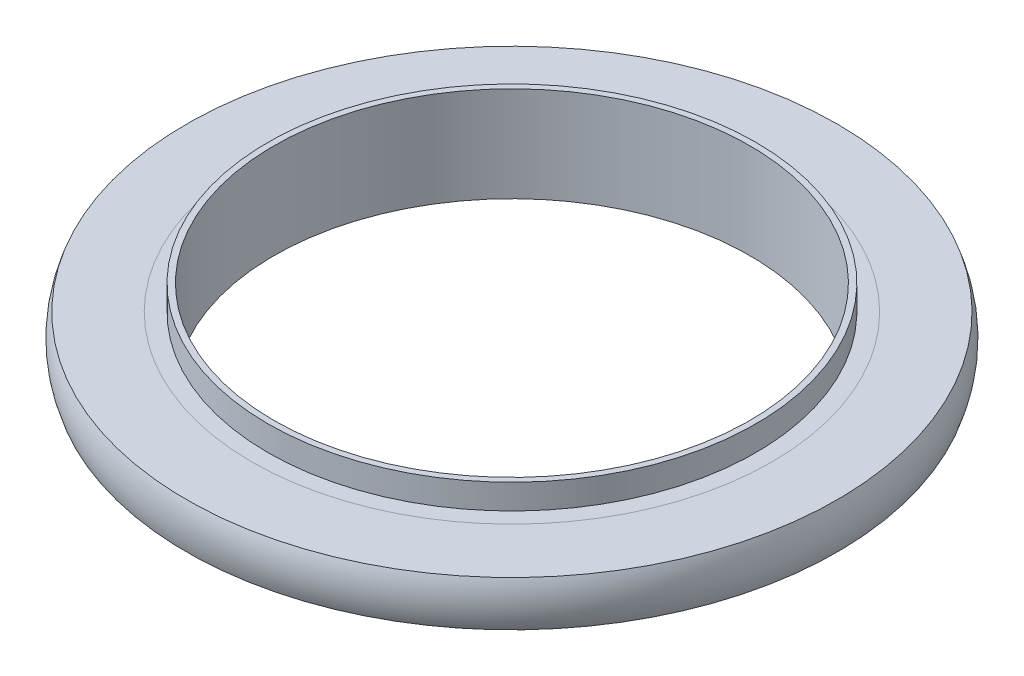
ISO-10303-21;
HEADER;
FILE_DESCRIPTION(('STEP AP214'),'2;1');
FILE_NAME('part.step','',(''),(''),'','','');
FILE_SCHEMA(('AUTOMOTIVE_DESIGN { 1 0 10303 214 1 1 1 1 }'));
ENDSEC;
DATA;
#1=APPLICATION_CONTEXT('core data for automotive mechanical design processes');
#2=APPLICATION_PROTOCOL_DEFINITION('international standard','automotive_design',2000,#1);
#3=PRODUCT_CONTEXT('',#1,'mechanical');
#4=PRODUCT('Part','Part','',(#3));
#5=PRODUCT_RELATED_PRODUCT_CATEGORY('part','',(#4));
#6=PRODUCT_DEFINITION_FORMATION('','',#4);
#7=PRODUCT_DEFINITION_CONTEXT('part definition',#1,'design');
#8=PRODUCT_DEFINITION('design','',#6,#7);
#9=PRODUCT_DEFINITION_SHAPE('','',#8);
#10=(LENGTH_UNIT() NAMED_UNIT(*) SI_UNIT(.MILLI.,.METRE.));
#11=(NAMED_UNIT(*) PLANE_ANGLE_UNIT() SI_UNIT($,.RADIAN.));
#12=(NAMED_UNIT(*) SI_UNIT($,.STERADIAN.) SOLID_ANGLE_UNIT());
#13=UNCERTAINTY_MEASURE_WITH_UNIT(LENGTH_MEASURE(1.E-05),#10,'distance_accuracy_value','');
#14=(GEOMETRIC_REPRESENTATION_CONTEXT(3) GLOBAL_UNCERTAINTY_ASSIGNED_CONTEXT((#13)) GLOBAL_UNIT_ASSIGNED_CONTEXT((#10,
#11,#12)) REPRESENTATION_CONTEXT('',''));
#15=CARTESIAN_POINT('',(0.,0.,0.));
#16=DIRECTION('',(0.,0.,1.));
#17=DIRECTION('',(1.,0.,0.));
#18=AXIS2_PLACEMENT_3D('',#15,#16,#17);
#19=CARTESIAN_POINT('',(0.,0.,0.));
#20=DIRECTION('',(0.,-1.,0.));
#21=DIRECTION('',(0.,0.,-1.));
#22=AXIS2_PLACEMENT_3D('',#19,#20,#21);
#23=TOROIDAL_SURFACE('',#22,26.8,5.3);
#24=CARTESIAN_POINT('',(0.,-1.905,0.));
#25=DIRECTION('',(0.,-1.,0.));
#26=DIRECTION('',(0.,0.,-1.));
#27=AXIS2_PLACEMENT_3D('',#24,#25,#26);
#28=CIRCLE('',#27,21.8541962230594);
#29=CARTESIAN_POINT('',(0.,-1.905,-21.8541962230594));
#30=VERTEX_POINT('',#29);
#31=EDGE_CURVE('E11',#30,#30,#28,.T.);
#32=ORIENTED_EDGE('',*,*,#31,.T.);
#33=EDGE_LOOP('',(#32));
#34=FACE_BOUND('',#33,.T.);
#35=CARTESIAN_POINT('',(0.,1.905,0.));
#36=DIRECTION('',(0.,-1.,0.));
#37=DIRECTION('',(0.,0.,-1.));
#38=AXIS2_PLACEMENT_3D('',#35,#36,#37);
#39=CIRCLE('',#38,21.8541962230594);
#40=CARTESIAN_POINT('',(0.,1.905,-21.8541962230594));
#41=VERTEX_POINT('',#40);
#42=EDGE_CURVE('E58',#41,#41,#39,.T.);
#43=ORIENTED_EDGE('',*,*,#42,.F.);
#44=EDGE_LOOP('',(#43));
#45=FACE_BOUND('',#44,.T.);
#46=ADVANCED_FACE('F44',(#34,#45),#23,.T.);
#47=CARTESIAN_POINT('',(21.8541962230594,-1.905,0.));
#48=DIRECTION('',(0.,-1.,0.));
#49=DIRECTION('',(0.,0.,-1.));
#50=AXIS2_PLACEMENT_3D('',#47,#48,#49);
#51=PLANE('',#50);
#52=CARTESIAN_POINT('',(0.,-1.905,0.));
#53=DIRECTION('',(0.,-1.,0.));
#54=DIRECTION('',(0.,0.,-1.));
#55=AXIS2_PLACEMENT_3D('',#52,#53,#54);
#56=CIRCLE('',#55,27.3458037769406);
#57=CARTESIAN_POINT('',(0.,-1.905,-27.3458037769406));
#58=VERTEX_POINT('',#57);
#59=EDGE_CURVE('E50',#58,#58,#56,.T.);
#60=ORIENTED_EDGE('',*,*,#59,.T.);
#61=EDGE_LOOP('',(#60));
#62=FACE_BOUND('',#61,.T.);
#63=ORIENTED_EDGE('',*,*,#31,.F.);
#64=EDGE_LOOP('',(#63));
#65=FACE_BOUND('',#64,.T.);
#66=ADVANCED_FACE('F68',(#62,#65),#51,.T.);
#67=CARTESIAN_POINT('',(0.,0.,0.));
#68=DIRECTION('',(0.,-1.,0.));
#69=DIRECTION('',(0.,0.,-1.));
#70=AXIS2_PLACEMENT_3D('',#67,#68,#69);
#71=TOROIDAL_SURFACE('',#70,22.4,5.3);
#72=CARTESIAN_POINT('',(0.,1.905,0.));
#73=DIRECTION('',(0.,-1.,0.));
#74=DIRECTION('',(0.,0.,-1.));
#75=AXIS2_PLACEMENT_3D('',#72,#73,#74);
#76=CIRCLE('',#75,27.3458037769406);
#77=CARTESIAN_POINT('',(0.,1.905,-27.3458037769406));
#78=VERTEX_POINT('',#77);
#79=EDGE_CURVE('E54',#78,#78,#76,.T.);
#80=ORIENTED_EDGE('',*,*,#79,.T.);
#81=EDGE_LOOP('',(#80));
#82=FACE_BOUND('',#81,.T.);
#83=ORIENTED_EDGE('',*,*,#59,.F.);
#84=EDGE_LOOP('',(#83));
#85=FACE_BOUND('',#84,.T.);
#86=ADVANCED_FACE('F72',(#82,#85),#71,.T.);
#87=CARTESIAN_POINT('',(21.8541962230594,1.905,0.));
#88=DIRECTION('',(0.,1.,0.));
#89=DIRECTION('',(0.,0.,1.));
#90=AXIS2_PLACEMENT_3D('',#87,#88,#89);
#91=PLANE('',#90);
#92=ORIENTED_EDGE('',*,*,#42,.T.);
#93=EDGE_LOOP('',(#92));
#94=FACE_BOUND('',#93,.T.);
#95=ORIENTED_EDGE('',*,*,#79,.F.);
#96=EDGE_LOOP('',(#95));
#97=FACE_BOUND('',#96,.T.);
#98=ADVANCED_FACE('F64',(#94,#97),#91,.T.);
#99=CLOSED_SHELL('',(#46,#66,#86,#98));
#100=MANIFOLD_SOLID_BREP('B2',#99);
#101=CARTESIAN_POINT('',(20.,4.,0.));
#102=DIRECTION('',(0.,-1.,0.));
#103=DIRECTION('',(0.,0.,-1.));
#104=AXIS2_PLACEMENT_3D('',#101,#102,#103);
#105=PLANE('',#104);
#106=CARTESIAN_POINT('',(0.,4.,0.));
#107=DIRECTION('',(0.,1.,0.));
#108=DIRECTION('',(0.,0.,1.));
#109=AXIS2_PLACEMENT_3D('',#106,#107,#108);
#110=CIRCLE('',#109,20.);
#111=CARTESIAN_POINT('',(0.,4.,20.));
#112=VERTEX_POINT('',#111);
#113=EDGE_CURVE('E43',#112,#112,#110,.T.);
#114=ORIENTED_EDGE('',*,*,#113,.F.);
#115=EDGE_LOOP('',(#114));
#116=FACE_BOUND('',#115,.T.);
#117=CARTESIAN_POINT('',(0.,4.,0.));
#118=DIRECTION('',(0.,1.,0.));
#119=DIRECTION('',(0.,0.,1.));
#120=AXIS2_PLACEMENT_3D('',#117,#118,#119);
#121=CIRCLE('',#120,20.5);
#122=CARTESIAN_POINT('',(0.,4.,20.5));
#123=VERTEX_POINT('',#122);
#124=EDGE_CURVE('E133',#123,#123,#121,.T.);
#125=ORIENTED_EDGE('',*,*,#124,.T.);
#126=EDGE_LOOP('',(#125));
#127=FACE_BOUND('',#126,.T.);
#128=ADVANCED_FACE('F105',(#116,#127),#105,.F.);
#129=CARTESIAN_POINT('',(0.,4.,0.));
#130=DIRECTION('',(0.,1.,0.));
#131=DIRECTION('',(0.,0.,1.));
#132=AXIS2_PLACEMENT_3D('',#129,#130,#131);
#133=CYLINDRICAL_SURFACE('',#132,20.);
#134=CARTESIAN_POINT('',(0.,-4.,0.));
#135=DIRECTION('',(0.,1.,0.));
#136=DIRECTION('',(0.,0.,1.));
#137=AXIS2_PLACEMENT_3D('',#134,#135,#136);
#138=CIRCLE('',#137,20.);
#139=CARTESIAN_POINT('',(0.,-4.,20.));
#140=VERTEX_POINT('',#139);
#141=EDGE_CURVE('E111',#140,#140,#138,.T.);
#142=ORIENTED_EDGE('',*,*,#141,.F.);
#143=EDGE_LOOP('',(#142));
#144=FACE_BOUND('',#143,.T.);
#145=ORIENTED_EDGE('',*,*,#113,.T.);
#146=EDGE_LOOP('',(#145));
#147=FACE_BOUND('',#146,.T.);
#148=ADVANCED_FACE('F170',(#144,#147),#133,.F.);
#149=CARTESIAN_POINT('',(20.,-4.,0.));
#150=DIRECTION('',(0.,1.,0.));
#151=DIRECTION('',(0.,0.,1.));
#152=AXIS2_PLACEMENT_3D('',#149,#150,#151);
#153=PLANE('',#152);
#154=CARTESIAN_POINT('',(0.,-4.,0.));
#155=DIRECTION('',(0.,1.,0.));
#156=DIRECTION('',(0.,0.,1.));
#157=AXIS2_PLACEMENT_3D('',#154,#155,#156);
#158=CIRCLE('',#157,20.5);
#159=CARTESIAN_POINT('',(0.,-4.,20.5));
#160=VERTEX_POINT('',#159);
#161=EDGE_CURVE('E115',#160,#160,#158,.T.);
#162=ORIENTED_EDGE('',*,*,#161,.F.);
#163=EDGE_LOOP('',(#162));
#164=FACE_BOUND('',#163,.T.);
#165=ORIENTED_EDGE('',*,*,#141,.T.);
#166=EDGE_LOOP('',(#165));
#167=FACE_BOUND('',#166,.T.);
#168=ADVANCED_FACE('F165',(#164,#167),#153,.F.);
#169=CARTESIAN_POINT('',(0.,4.,0.));
#170=DIRECTION('',(0.,1.,0.));
#171=DIRECTION('',(0.,0.,1.));
#172=AXIS2_PLACEMENT_3D('',#169,#170,#171);
#173=CYLINDRICAL_SURFACE('',#172,20.5);
#174=CARTESIAN_POINT('',(0.,-1.905,0.));
#175=DIRECTION('',(0.,1.,0.));
#176=DIRECTION('',(0.,0.,1.));
#177=AXIS2_PLACEMENT_3D('',#174,#175,#176);
#178=CIRCLE('',#177,20.5);
#179=CARTESIAN_POINT('',(0.,-1.905,20.5));
#180=VERTEX_POINT('',#179);
#181=EDGE_CURVE('E119',#180,#180,#178,.T.);
#182=ORIENTED_EDGE('',*,*,#181,.F.);
#183=EDGE_LOOP('',(#182));
#184=FACE_BOUND('',#183,.T.);
#185=ORIENTED_EDGE('',*,*,#161,.T.);
#186=EDGE_LOOP('',(#185));
#187=FACE_BOUND('',#186,.T.);
#188=ADVANCED_FACE('F159',(#184,#187),#173,.T.);
#189=CARTESIAN_POINT('',(20.5,-1.905,0.));
#190=DIRECTION('',(0.,1.,0.));
#191=DIRECTION('',(0.,0.,1.));
#192=AXIS2_PLACEMENT_3D('',#189,#190,#191);
#193=PLANE('',#192);
#194=CARTESIAN_POINT('',(0.,-1.905,0.));
#195=DIRECTION('',(0.,1.,0.));
#196=DIRECTION('',(0.,0.,1.));
#197=AXIS2_PLACEMENT_3D('',#194,#195,#196);
#198=CIRCLE('',#197,21.8541962230594);
#199=CARTESIAN_POINT('',(0.,-1.905,21.8541962230594));
#200=VERTEX_POINT('',#199);
#201=EDGE_CURVE('E124',#200,#200,#198,.T.);
#202=ORIENTED_EDGE('',*,*,#201,.F.);
#203=EDGE_LOOP('',(#202));
#204=FACE_BOUND('',#203,.T.);
#205=ORIENTED_EDGE('',*,*,#181,.T.);
#206=EDGE_LOOP('',(#205));
#207=FACE_BOUND('',#206,.T.);
#208=ADVANCED_FACE('F153',(#204,#207),#193,.F.);
#209=CARTESIAN_POINT('',(0.,0.,0.));
#210=DIRECTION('',(0.,1.,0.));
#211=DIRECTION('',(0.,0.,1.));
#212=AXIS2_PLACEMENT_3D('',#209,#210,#211);
#213=TOROIDAL_SURFACE('',#212,26.8,5.3);
#214=CARTESIAN_POINT('',(0.,1.905,0.));
#215=DIRECTION('',(0.,1.,0.));
#216=DIRECTION('',(0.,0.,1.));
#217=AXIS2_PLACEMENT_3D('',#214,#215,#216);
#218=CIRCLE('',#217,21.8541962230594);
#219=CARTESIAN_POINT('',(0.,1.905,21.8541962230594));
#220=VERTEX_POINT('',#219);
#221=EDGE_CURVE('E127',#220,#220,#218,.T.);
#222=ORIENTED_EDGE('',*,*,#221,.F.);
#223=EDGE_LOOP('',(#222));
#224=FACE_BOUND('',#223,.T.);
#225=ORIENTED_EDGE('',*,*,#201,.T.);
#226=EDGE_LOOP('',(#225));
#227=FACE_BOUND('',#226,.T.);
#228=ADVANCED_FACE('F147',(#224,#227),#213,.F.);
#229=CARTESIAN_POINT('',(20.5,1.905,0.));
#230=DIRECTION('',(0.,-1.,0.));
#231=DIRECTION('',(0.,0.,-1.));
#232=AXIS2_PLACEMENT_3D('',#229,#230,#231);
#233=PLANE('',#232);
#234=CARTESIAN_POINT('',(0.,1.905,0.));
#235=DIRECTION('',(0.,1.,0.));
#236=DIRECTION('',(0.,0.,1.));
#237=AXIS2_PLACEMENT_3D('',#234,#235,#236);
#238=CIRCLE('',#237,20.5);
#239=CARTESIAN_POINT('',(0.,1.905,20.5));
#240=VERTEX_POINT('',#239);
#241=EDGE_CURVE('E130',#240,#240,#238,.T.);
#242=ORIENTED_EDGE('',*,*,#241,.F.);
#243=EDGE_LOOP('',(#242));
#244=FACE_BOUND('',#243,.T.);
#245=ORIENTED_EDGE('',*,*,#221,.T.);
#246=EDGE_LOOP('',(#245));
#247=FACE_BOUND('',#246,.T.);
#248=ADVANCED_FACE('F141',(#244,#247),#233,.F.);
#249=CARTESIAN_POINT('',(0.,4.,0.));
#250=DIRECTION('',(0.,1.,0.));
#251=DIRECTION('',(0.,0.,1.));
#252=AXIS2_PLACEMENT_3D('',#249,#250,#251);
#253=CYLINDRICAL_SURFACE('',#252,20.5);
#254=ORIENTED_EDGE('',*,*,#124,.F.);
#255=EDGE_LOOP('',(#254));
#256=FACE_BOUND('',#255,.T.);
#257=ORIENTED_EDGE('',*,*,#241,.T.);
#258=EDGE_LOOP('',(#257));
#259=FACE_BOUND('',#258,.T.);
#260=ADVANCED_FACE('F138',(#256,#259),#253,.T.);
#261=CLOSED_SHELL('',(#128,#148,#168,#188,#208,#228,#248,#260));
#262=MANIFOLD_SOLID_BREP('B6',#261);
#263=ADVANCED_BREP_SHAPE_REPRESENTATION('',(#18,#100,#262),#14);
#264=SHAPE_DEFINITION_REPRESENTATION(#9,#263);
ENDSEC;
END-ISO-10303-21;
